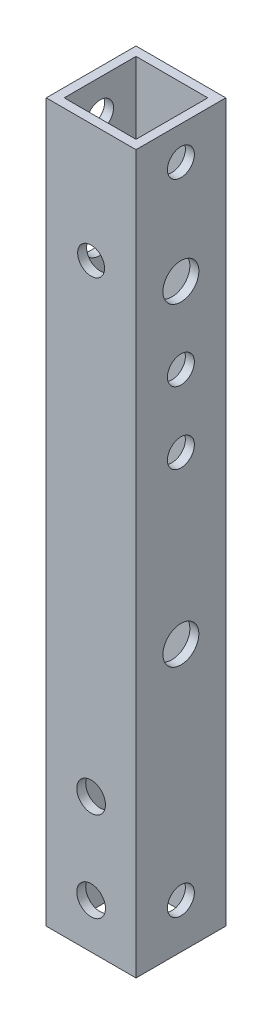
ISO-10303-21;
HEADER;
FILE_DESCRIPTION(('STEP AP214'),'2;1');
FILE_NAME('part.step','',(''),(''),'','','');
FILE_SCHEMA(('AUTOMOTIVE_DESIGN { 1 0 10303 214 1 1 1 1 }'));
ENDSEC;
DATA;
#1=APPLICATION_CONTEXT('core data for automotive mechanical design processes');
#2=APPLICATION_PROTOCOL_DEFINITION('international standard','automotive_design',2000,#1);
#3=PRODUCT_CONTEXT('',#1,'mechanical');
#4=PRODUCT('Part','Part','',(#3));
#5=PRODUCT_RELATED_PRODUCT_CATEGORY('part','',(#4));
#6=PRODUCT_DEFINITION_FORMATION('','',#4);
#7=PRODUCT_DEFINITION_CONTEXT('part definition',#1,'design');
#8=PRODUCT_DEFINITION('design','',#6,#7);
#9=PRODUCT_DEFINITION_SHAPE('','',#8);
#10=(LENGTH_UNIT() NAMED_UNIT(*) SI_UNIT(.MILLI.,.METRE.));
#11=(NAMED_UNIT(*) PLANE_ANGLE_UNIT() SI_UNIT($,.RADIAN.));
#12=(NAMED_UNIT(*) SI_UNIT($,.STERADIAN.) SOLID_ANGLE_UNIT());
#13=UNCERTAINTY_MEASURE_WITH_UNIT(LENGTH_MEASURE(1.E-05),#10,'distance_accuracy_value','');
#14=(GEOMETRIC_REPRESENTATION_CONTEXT(3) GLOBAL_UNCERTAINTY_ASSIGNED_CONTEXT((#13)) GLOBAL_UNIT_ASSIGNED_CONTEXT((#10,
#11,#12)) REPRESENTATION_CONTEXT('',''));
#15=CARTESIAN_POINT('',(0.,0.,0.));
#16=DIRECTION('',(0.,0.,1.));
#17=DIRECTION('',(1.,0.,0.));
#18=AXIS2_PLACEMENT_3D('',#15,#16,#17);
#19=CARTESIAN_POINT('',(0.,0.,0.));
#20=DIRECTION('',(0.,1.,0.));
#21=DIRECTION('',(0.,0.,1.));
#22=AXIS2_PLACEMENT_3D('',#19,#20,#21);
#23=PLANE('',#22);
#24=DIRECTION('',(0.,0.,-1.));
#25=VECTOR('',#24,1.);
#26=CARTESIAN_POINT('',(5.,0.,5.));
#27=LINE('',#26,#25);
#28=CARTESIAN_POINT('',(5.,0.,5.));
#29=VERTEX_POINT('',#28);
#30=CARTESIAN_POINT('',(5.,0.,-5.));
#31=VERTEX_POINT('',#30);
#32=EDGE_CURVE('E146',#29,#31,#27,.T.);
#33=ORIENTED_EDGE('',*,*,#32,.F.);
#34=DIRECTION('',(1.,0.,0.));
#35=VECTOR('',#34,1.);
#36=CARTESIAN_POINT('',(-5.,0.,5.));
#37=LINE('',#36,#35);
#38=CARTESIAN_POINT('',(-5.,0.,5.));
#39=VERTEX_POINT('',#38);
#40=EDGE_CURVE('E281',#39,#29,#37,.T.);
#41=ORIENTED_EDGE('',*,*,#40,.F.);
#42=DIRECTION('',(0.,0.,1.));
#43=VECTOR('',#42,1.);
#44=CARTESIAN_POINT('',(-5.,0.,5.));
#45=LINE('',#44,#43);
#46=CARTESIAN_POINT('',(-5.,0.,-5.));
#47=VERTEX_POINT('',#46);
#48=EDGE_CURVE('E277',#47,#39,#45,.T.);
#49=ORIENTED_EDGE('',*,*,#48,.F.);
#50=DIRECTION('',(-1.,0.,0.));
#51=VECTOR('',#50,1.);
#52=CARTESIAN_POINT('',(-5.,0.,-5.));
#53=LINE('',#52,#51);
#54=EDGE_CURVE('E274',#31,#47,#53,.T.);
#55=ORIENTED_EDGE('',*,*,#54,.F.);
#56=EDGE_LOOP('',(#33,#41,#49,#55));
#57=FACE_BOUND('',#56,.T.);
#58=DIRECTION('',(0.,0.,-1.));
#59=VECTOR('',#58,1.);
#60=CARTESIAN_POINT('',(4.,0.,0.));
#61=LINE('',#60,#59);
#62=CARTESIAN_POINT('',(4.,0.,4.));
#63=VERTEX_POINT('',#62);
#64=CARTESIAN_POINT('',(4.,0.,-4.));
#65=VERTEX_POINT('',#64);
#66=EDGE_CURVE('E244',#63,#65,#61,.T.);
#67=ORIENTED_EDGE('',*,*,#66,.T.);
#68=DIRECTION('',(-1.,0.,0.));
#69=VECTOR('',#68,1.);
#70=CARTESIAN_POINT('',(0.,0.,-4.));
#71=LINE('',#70,#69);
#72=CARTESIAN_POINT('',(-4.,0.,-4.));
#73=VERTEX_POINT('',#72);
#74=EDGE_CURVE('E248',#65,#73,#71,.T.);
#75=ORIENTED_EDGE('',*,*,#74,.T.);
#76=DIRECTION('',(0.,0.,1.));
#77=VECTOR('',#76,1.);
#78=CARTESIAN_POINT('',(-4.,0.,0.));
#79=LINE('',#78,#77);
#80=CARTESIAN_POINT('',(-4.,0.,4.));
#81=VERTEX_POINT('',#80);
#82=EDGE_CURVE('E252',#73,#81,#79,.T.);
#83=ORIENTED_EDGE('',*,*,#82,.T.);
#84=DIRECTION('',(1.,0.,0.));
#85=VECTOR('',#84,1.);
#86=CARTESIAN_POINT('',(0.,0.,4.));
#87=LINE('',#86,#85);
#88=EDGE_CURVE('E256',#81,#63,#87,.T.);
#89=ORIENTED_EDGE('',*,*,#88,.T.);
#90=EDGE_LOOP('',(#67,#75,#83,#89));
#91=FACE_BOUND('',#90,.T.);
#92=ADVANCED_FACE('F63',(#57,#91),#23,.F.);
#93=CARTESIAN_POINT('',(5.,104.9,5.));
#94=DIRECTION('',(-1.,0.,0.));
#95=DIRECTION('',(0.,0.,1.));
#96=AXIS2_PLACEMENT_3D('',#93,#94,#95);
#97=PLANE('',#96);
#98=CARTESIAN_POINT('',(5.,5.,0.));
#99=DIRECTION('',(1.,0.,0.));
#100=DIRECTION('',(0.,0.,-1.));
#101=AXIS2_PLACEMENT_3D('',#98,#99,#100);
#102=CIRCLE('',#101,1.5);
#103=CARTESIAN_POINT('',(5.,5.,-1.5));
#104=VERTEX_POINT('',#103);
#105=EDGE_CURVE('E333',#104,#104,#102,.T.);
#106=ORIENTED_EDGE('',*,*,#105,.F.);
#107=EDGE_LOOP('',(#106));
#108=FACE_BOUND('',#107,.T.);
#109=CARTESIAN_POINT('',(5.,29.7,0.));
#110=DIRECTION('',(1.,0.,0.));
#111=DIRECTION('',(0.,0.,-1.));
#112=AXIS2_PLACEMENT_3D('',#109,#110,#111);
#113=CIRCLE('',#112,2.);
#114=CARTESIAN_POINT('',(5.,29.7,-2.));
#115=VERTEX_POINT('',#114);
#116=EDGE_CURVE('E357',#115,#115,#113,.T.);
#117=ORIENTED_EDGE('',*,*,#116,.F.);
#118=EDGE_LOOP('',(#117));
#119=FACE_BOUND('',#118,.T.);
#120=CARTESIAN_POINT('',(5.,76.2,0.));
#121=DIRECTION('',(1.,0.,0.));
#122=DIRECTION('',(0.,0.,-1.));
#123=AXIS2_PLACEMENT_3D('',#120,#121,#122);
#124=CIRCLE('',#123,1.5);
#125=CARTESIAN_POINT('',(5.,76.2,-1.5));
#126=VERTEX_POINT('',#125);
#127=EDGE_CURVE('E338',#126,#126,#124,.T.);
#128=ORIENTED_EDGE('',*,*,#127,.F.);
#129=EDGE_LOOP('',(#128));
#130=FACE_BOUND('',#129,.T.);
#131=CARTESIAN_POINT('',(5.,48.2,0.));
#132=DIRECTION('',(1.,0.,0.));
#133=DIRECTION('',(0.,0.,-1.));
#134=AXIS2_PLACEMENT_3D('',#131,#132,#133);
#135=CIRCLE('',#134,1.5);
#136=CARTESIAN_POINT('',(5.,48.2,-1.5));
#137=VERTEX_POINT('',#136);
#138=EDGE_CURVE('E339',#137,#137,#135,.T.);
#139=ORIENTED_EDGE('',*,*,#138,.F.);
#140=EDGE_LOOP('',(#139));
#141=FACE_BOUND('',#140,.T.);
#142=CARTESIAN_POINT('',(5.,56.2,0.));
#143=DIRECTION('',(1.,0.,0.));
#144=DIRECTION('',(0.,0.,-1.));
#145=AXIS2_PLACEMENT_3D('',#142,#143,#144);
#146=CIRCLE('',#145,1.5);
#147=CARTESIAN_POINT('',(5.,56.2,-1.5));
#148=VERTEX_POINT('',#147);
#149=EDGE_CURVE('E347',#148,#148,#146,.T.);
#150=ORIENTED_EDGE('',*,*,#149,.F.);
#151=EDGE_LOOP('',(#150));
#152=FACE_BOUND('',#151,.T.);
#153=CARTESIAN_POINT('',(5.,64.7,0.));
#154=DIRECTION('',(1.,0.,0.));
#155=DIRECTION('',(0.,0.,-1.));
#156=AXIS2_PLACEMENT_3D('',#153,#154,#155);
#157=CIRCLE('',#156,2.);
#158=CARTESIAN_POINT('',(5.,64.7,-2.));
#159=VERTEX_POINT('',#158);
#160=EDGE_CURVE('E356',#159,#159,#157,.T.);
#161=ORIENTED_EDGE('',*,*,#160,.F.);
#162=EDGE_LOOP('',(#161));
#163=FACE_BOUND('',#162,.T.);
#164=DIRECTION('',(0.,-1.,0.));
#165=VECTOR('',#164,1.);
#166=CARTESIAN_POINT('',(5.,104.9,-5.));
#167=LINE('',#166,#165);
#168=CARTESIAN_POINT('',(5.,79.9,-5.));
#169=VERTEX_POINT('',#168);
#170=EDGE_CURVE('E72',#169,#31,#167,.T.);
#171=ORIENTED_EDGE('',*,*,#170,.F.);
#172=DIRECTION('',(0.,0.,-1.));
#173=VECTOR('',#172,1.);
#174=CARTESIAN_POINT('',(5.,79.9,5.));
#175=LINE('',#174,#173);
#176=CARTESIAN_POINT('',(5.,79.9,5.));
#177=VERTEX_POINT('',#176);
#178=EDGE_CURVE('E126',#177,#169,#175,.T.);
#179=ORIENTED_EDGE('',*,*,#178,.F.);
#180=DIRECTION('',(0.,-1.,0.));
#181=VECTOR('',#180,1.);
#182=CARTESIAN_POINT('',(5.,104.9,5.));
#183=LINE('',#182,#181);
#184=EDGE_CURVE('E285',#177,#29,#183,.T.);
#185=ORIENTED_EDGE('',*,*,#184,.T.);
#186=ORIENTED_EDGE('',*,*,#32,.T.);
#187=EDGE_LOOP('',(#171,#179,#185,#186));
#188=FACE_BOUND('',#187,.T.);
#189=ADVANCED_FACE('F65',(#108,#119,#130,#141,#152,#163,#188),#97,.F.);
#190=CARTESIAN_POINT('',(-5.,104.9,-5.));
#191=DIRECTION('',(0.,0.,1.));
#192=DIRECTION('',(1.,0.,0.));
#193=AXIS2_PLACEMENT_3D('',#190,#191,#192);
#194=PLANE('',#193);
#195=CARTESIAN_POINT('',(0.,5.,-5.));
#196=DIRECTION('',(0.,0.,1.));
#197=DIRECTION('',(1.,0.,0.));
#198=AXIS2_PLACEMENT_3D('',#195,#196,#197);
#199=CIRCLE('',#198,1.6);
#200=CARTESIAN_POINT('',(1.6,5.,-5.));
#201=VERTEX_POINT('',#200);
#202=EDGE_CURVE('E159',#201,#201,#199,.T.);
#203=ORIENTED_EDGE('',*,*,#202,.T.);
#204=EDGE_LOOP('',(#203));
#205=FACE_BOUND('',#204,.T.);
#206=CARTESIAN_POINT('',(0.,66.7,-5.));
#207=DIRECTION('',(0.,0.,1.));
#208=DIRECTION('',(1.,0.,0.));
#209=AXIS2_PLACEMENT_3D('',#206,#207,#208);
#210=CIRCLE('',#209,1.5);
#211=CARTESIAN_POINT('',(1.5,66.7,-5.));
#212=VERTEX_POINT('',#211);
#213=EDGE_CURVE('E228',#212,#212,#210,.T.);
#214=ORIENTED_EDGE('',*,*,#213,.T.);
#215=EDGE_LOOP('',(#214));
#216=FACE_BOUND('',#215,.T.);
#217=CARTESIAN_POINT('',(0.,15.,-5.));
#218=DIRECTION('',(0.,0.,1.));
#219=DIRECTION('',(1.,0.,0.));
#220=AXIS2_PLACEMENT_3D('',#217,#218,#219);
#221=CIRCLE('',#220,1.6);
#222=CARTESIAN_POINT('',(1.6,15.,-5.));
#223=VERTEX_POINT('',#222);
#224=EDGE_CURVE('E213',#223,#223,#221,.T.);
#225=ORIENTED_EDGE('',*,*,#224,.T.);
#226=EDGE_LOOP('',(#225));
#227=FACE_BOUND('',#226,.T.);
#228=DIRECTION('',(0.,-1.,0.));
#229=VECTOR('',#228,1.);
#230=CARTESIAN_POINT('',(-5.,104.9,-5.));
#231=LINE('',#230,#229);
#232=CARTESIAN_POINT('',(-5.,79.9,-5.));
#233=VERTEX_POINT('',#232);
#234=EDGE_CURVE('E141',#233,#47,#231,.T.);
#235=ORIENTED_EDGE('',*,*,#234,.F.);
#236=DIRECTION('',(-1.,0.,0.));
#237=VECTOR('',#236,1.);
#238=CARTESIAN_POINT('',(-5.,79.9,-5.));
#239=LINE('',#238,#237);
#240=EDGE_CURVE('E129',#169,#233,#239,.T.);
#241=ORIENTED_EDGE('',*,*,#240,.F.);
#242=ORIENTED_EDGE('',*,*,#170,.T.);
#243=ORIENTED_EDGE('',*,*,#54,.T.);
#244=EDGE_LOOP('',(#235,#241,#242,#243));
#245=FACE_BOUND('',#244,.T.);
#246=ADVANCED_FACE('F138',(#205,#216,#227,#245),#194,.F.);
#247=CARTESIAN_POINT('',(-5.,104.9,5.));
#248=DIRECTION('',(1.,0.,0.));
#249=DIRECTION('',(0.,0.,-1.));
#250=AXIS2_PLACEMENT_3D('',#247,#248,#249);
#251=PLANE('',#250);
#252=CARTESIAN_POINT('',(-5.,5.,0.));
#253=DIRECTION('',(1.,0.,0.));
#254=DIRECTION('',(0.,0.,-1.));
#255=AXIS2_PLACEMENT_3D('',#252,#253,#254);
#256=CIRCLE('',#255,1.5);
#257=CARTESIAN_POINT('',(-5.,5.,-1.5));
#258=VERTEX_POINT('',#257);
#259=EDGE_CURVE('E351',#258,#258,#256,.T.);
#260=ORIENTED_EDGE('',*,*,#259,.T.);
#261=EDGE_LOOP('',(#260));
#262=FACE_BOUND('',#261,.T.);
#263=CARTESIAN_POINT('',(-5.,29.7,0.));
#264=DIRECTION('',(1.,0.,0.));
#265=DIRECTION('',(0.,0.,-1.));
#266=AXIS2_PLACEMENT_3D('',#263,#264,#265);
#267=CIRCLE('',#266,2.);
#268=CARTESIAN_POINT('',(-5.,29.7,-2.));
#269=VERTEX_POINT('',#268);
#270=EDGE_CURVE('E352',#269,#269,#267,.T.);
#271=ORIENTED_EDGE('',*,*,#270,.T.);
#272=EDGE_LOOP('',(#271));
#273=FACE_BOUND('',#272,.T.);
#274=CARTESIAN_POINT('',(-5.,76.2,0.));
#275=DIRECTION('',(1.,0.,0.));
#276=DIRECTION('',(0.,0.,-1.));
#277=AXIS2_PLACEMENT_3D('',#274,#275,#276);
#278=CIRCLE('',#277,1.5);
#279=CARTESIAN_POINT('',(-5.,76.2,-1.5));
#280=VERTEX_POINT('',#279);
#281=EDGE_CURVE('E361',#280,#280,#278,.T.);
#282=ORIENTED_EDGE('',*,*,#281,.T.);
#283=EDGE_LOOP('',(#282));
#284=FACE_BOUND('',#283,.T.);
#285=CARTESIAN_POINT('',(-5.,48.2,0.));
#286=DIRECTION('',(1.,0.,0.));
#287=DIRECTION('',(0.,0.,-1.));
#288=AXIS2_PLACEMENT_3D('',#285,#286,#287);
#289=CIRCLE('',#288,1.5);
#290=CARTESIAN_POINT('',(-5.,48.2,-1.5));
#291=VERTEX_POINT('',#290);
#292=EDGE_CURVE('E334',#291,#291,#289,.T.);
#293=ORIENTED_EDGE('',*,*,#292,.T.);
#294=EDGE_LOOP('',(#293));
#295=FACE_BOUND('',#294,.T.);
#296=CARTESIAN_POINT('',(-5.,56.2,0.));
#297=DIRECTION('',(1.,0.,0.));
#298=DIRECTION('',(0.,0.,-1.));
#299=AXIS2_PLACEMENT_3D('',#296,#297,#298);
#300=CIRCLE('',#299,1.5);
#301=CARTESIAN_POINT('',(-5.,56.2,-1.5));
#302=VERTEX_POINT('',#301);
#303=EDGE_CURVE('E343',#302,#302,#300,.T.);
#304=ORIENTED_EDGE('',*,*,#303,.T.);
#305=EDGE_LOOP('',(#304));
#306=FACE_BOUND('',#305,.T.);
#307=CARTESIAN_POINT('',(-5.,64.7,0.));
#308=DIRECTION('',(1.,0.,0.));
#309=DIRECTION('',(0.,0.,-1.));
#310=AXIS2_PLACEMENT_3D('',#307,#308,#309);
#311=CIRCLE('',#310,2.);
#312=CARTESIAN_POINT('',(-5.,64.7,-2.));
#313=VERTEX_POINT('',#312);
#314=EDGE_CURVE('E175',#313,#313,#311,.T.);
#315=ORIENTED_EDGE('',*,*,#314,.T.);
#316=EDGE_LOOP('',(#315));
#317=FACE_BOUND('',#316,.T.);
#318=DIRECTION('',(0.,-1.,0.));
#319=VECTOR('',#318,1.);
#320=CARTESIAN_POINT('',(-5.,104.9,5.));
#321=LINE('',#320,#319);
#322=CARTESIAN_POINT('',(-5.,79.9,5.));
#323=VERTEX_POINT('',#322);
#324=EDGE_CURVE('E150',#323,#39,#321,.T.);
#325=ORIENTED_EDGE('',*,*,#324,.F.);
#326=DIRECTION('',(0.,0.,1.));
#327=VECTOR('',#326,1.);
#328=CARTESIAN_POINT('',(-5.,79.9,5.));
#329=LINE('',#328,#327);
#330=EDGE_CURVE('E79',#233,#323,#329,.T.);
#331=ORIENTED_EDGE('',*,*,#330,.F.);
#332=ORIENTED_EDGE('',*,*,#234,.T.);
#333=ORIENTED_EDGE('',*,*,#48,.T.);
#334=EDGE_LOOP('',(#325,#331,#332,#333));
#335=FACE_BOUND('',#334,.T.);
#336=ADVANCED_FACE('F294',(#262,#273,#284,#295,#306,#317,#335),#251,.F.);
#337=CARTESIAN_POINT('',(-5.,104.9,5.));
#338=DIRECTION('',(0.,0.,-1.));
#339=DIRECTION('',(-1.,0.,0.));
#340=AXIS2_PLACEMENT_3D('',#337,#338,#339);
#341=PLANE('',#340);
#342=CARTESIAN_POINT('',(0.,5.,5.));
#343=DIRECTION('',(0.,0.,1.));
#344=DIRECTION('',(1.,0.,0.));
#345=AXIS2_PLACEMENT_3D('',#342,#343,#344);
#346=CIRCLE('',#345,1.6);
#347=CARTESIAN_POINT('',(1.6,5.,5.));
#348=VERTEX_POINT('',#347);
#349=EDGE_CURVE('E224',#348,#348,#346,.T.);
#350=ORIENTED_EDGE('',*,*,#349,.F.);
#351=EDGE_LOOP('',(#350));
#352=FACE_BOUND('',#351,.T.);
#353=CARTESIAN_POINT('',(0.,66.7,5.));
#354=DIRECTION('',(0.,0.,1.));
#355=DIRECTION('',(1.,0.,0.));
#356=AXIS2_PLACEMENT_3D('',#353,#354,#355);
#357=CIRCLE('',#356,1.5);
#358=CARTESIAN_POINT('',(1.5,66.7,5.));
#359=VERTEX_POINT('',#358);
#360=EDGE_CURVE('E217',#359,#359,#357,.T.);
#361=ORIENTED_EDGE('',*,*,#360,.F.);
#362=EDGE_LOOP('',(#361));
#363=FACE_BOUND('',#362,.T.);
#364=CARTESIAN_POINT('',(0.,15.,5.));
#365=DIRECTION('',(0.,0.,1.));
#366=DIRECTION('',(1.,0.,0.));
#367=AXIS2_PLACEMENT_3D('',#364,#365,#366);
#368=CIRCLE('',#367,1.6);
#369=CARTESIAN_POINT('',(1.6,15.,5.));
#370=VERTEX_POINT('',#369);
#371=EDGE_CURVE('E204',#370,#370,#368,.T.);
#372=ORIENTED_EDGE('',*,*,#371,.F.);
#373=EDGE_LOOP('',(#372));
#374=FACE_BOUND('',#373,.T.);
#375=ORIENTED_EDGE('',*,*,#184,.F.);
#376=DIRECTION('',(1.,0.,0.));
#377=VECTOR('',#376,1.);
#378=CARTESIAN_POINT('',(-5.,79.9,5.));
#379=LINE('',#378,#377);
#380=EDGE_CURVE('E130',#323,#177,#379,.T.);
#381=ORIENTED_EDGE('',*,*,#380,.F.);
#382=ORIENTED_EDGE('',*,*,#324,.T.);
#383=ORIENTED_EDGE('',*,*,#40,.T.);
#384=EDGE_LOOP('',(#375,#381,#382,#383));
#385=FACE_BOUND('',#384,.T.);
#386=ADVANCED_FACE('F290',(#352,#363,#374,#385),#341,.F.);
#387=CARTESIAN_POINT('',(4.,104.9,0.));
#388=DIRECTION('',(-1.,0.,0.));
#389=DIRECTION('',(0.,0.,1.));
#390=AXIS2_PLACEMENT_3D('',#387,#388,#389);
#391=PLANE('',#390);
#392=DIRECTION('',(0.,0.,1.));
#393=VECTOR('',#392,1.);
#394=CARTESIAN_POINT('',(4.,79.9,0.));
#395=LINE('',#394,#393);
#396=CARTESIAN_POINT('',(4.,79.9,-4.));
#397=VERTEX_POINT('',#396);
#398=CARTESIAN_POINT('',(4.,79.9,4.));
#399=VERTEX_POINT('',#398);
#400=EDGE_CURVE('E86',#397,#399,#395,.T.);
#401=ORIENTED_EDGE('',*,*,#400,.F.);
#402=DIRECTION('',(0.,-1.,0.));
#403=VECTOR('',#402,1.);
#404=CARTESIAN_POINT('',(4.,104.9,-4.));
#405=LINE('',#404,#403);
#406=EDGE_CURVE('E269',#397,#65,#405,.T.);
#407=ORIENTED_EDGE('',*,*,#406,.T.);
#408=ORIENTED_EDGE('',*,*,#66,.F.);
#409=DIRECTION('',(0.,-1.,0.));
#410=VECTOR('',#409,1.);
#411=CARTESIAN_POINT('',(4.,104.9,4.));
#412=LINE('',#411,#410);
#413=EDGE_CURVE('E260',#399,#63,#412,.T.);
#414=ORIENTED_EDGE('',*,*,#413,.F.);
#415=EDGE_LOOP('',(#401,#407,#408,#414));
#416=FACE_BOUND('',#415,.T.);
#417=CARTESIAN_POINT('',(4.,5.,0.));
#418=DIRECTION('',(-1.,0.,0.));
#419=DIRECTION('',(0.,0.,1.));
#420=AXIS2_PLACEMENT_3D('',#417,#418,#419);
#421=CIRCLE('',#420,1.5);
#422=CARTESIAN_POINT('',(4.,5.,1.5));
#423=VERTEX_POINT('',#422);
#424=EDGE_CURVE('E198',#423,#423,#421,.T.);
#425=ORIENTED_EDGE('',*,*,#424,.F.);
#426=EDGE_LOOP('',(#425));
#427=FACE_BOUND('',#426,.T.);
#428=CARTESIAN_POINT('',(4.,29.7,0.));
#429=DIRECTION('',(-1.,0.,0.));
#430=DIRECTION('',(0.,0.,1.));
#431=AXIS2_PLACEMENT_3D('',#428,#429,#430);
#432=CIRCLE('',#431,2.);
#433=CARTESIAN_POINT('',(4.,29.7,2.));
#434=VERTEX_POINT('',#433);
#435=EDGE_CURVE('E194',#434,#434,#432,.T.);
#436=ORIENTED_EDGE('',*,*,#435,.F.);
#437=EDGE_LOOP('',(#436));
#438=FACE_BOUND('',#437,.T.);
#439=CARTESIAN_POINT('',(4.,76.2,0.));
#440=DIRECTION('',(-1.,0.,0.));
#441=DIRECTION('',(0.,0.,1.));
#442=AXIS2_PLACEMENT_3D('',#439,#440,#441);
#443=CIRCLE('',#442,1.5);
#444=CARTESIAN_POINT('',(4.,76.2,1.5));
#445=VERTEX_POINT('',#444);
#446=EDGE_CURVE('E190',#445,#445,#443,.T.);
#447=ORIENTED_EDGE('',*,*,#446,.F.);
#448=EDGE_LOOP('',(#447));
#449=FACE_BOUND('',#448,.T.);
#450=CARTESIAN_POINT('',(4.,48.2,0.));
#451=DIRECTION('',(-1.,0.,0.));
#452=DIRECTION('',(0.,0.,1.));
#453=AXIS2_PLACEMENT_3D('',#450,#451,#452);
#454=CIRCLE('',#453,1.5);
#455=CARTESIAN_POINT('',(4.,48.2,1.5));
#456=VERTEX_POINT('',#455);
#457=EDGE_CURVE('E185',#456,#456,#454,.T.);
#458=ORIENTED_EDGE('',*,*,#457,.F.);
#459=EDGE_LOOP('',(#458));
#460=FACE_BOUND('',#459,.T.);
#461=CARTESIAN_POINT('',(4.,56.2,0.));
#462=DIRECTION('',(-1.,0.,0.));
#463=DIRECTION('',(0.,0.,1.));
#464=AXIS2_PLACEMENT_3D('',#461,#462,#463);
#465=CIRCLE('',#464,1.5);
#466=CARTESIAN_POINT('',(4.,56.2,1.5));
#467=VERTEX_POINT('',#466);
#468=EDGE_CURVE('E180',#467,#467,#465,.T.);
#469=ORIENTED_EDGE('',*,*,#468,.F.);
#470=EDGE_LOOP('',(#469));
#471=FACE_BOUND('',#470,.T.);
#472=CARTESIAN_POINT('',(4.,64.7,0.));
#473=DIRECTION('',(-1.,0.,0.));
#474=DIRECTION('',(0.,0.,1.));
#475=AXIS2_PLACEMENT_3D('',#472,#473,#474);
#476=CIRCLE('',#475,2.);
#477=CARTESIAN_POINT('',(4.,64.7,2.));
#478=VERTEX_POINT('',#477);
#479=EDGE_CURVE('E174',#478,#478,#476,.T.);
#480=ORIENTED_EDGE('',*,*,#479,.F.);
#481=EDGE_LOOP('',(#480));
#482=FACE_BOUND('',#481,.T.);
#483=ADVANCED_FACE('F304',(#416,#427,#438,#449,#460,#471,#482),#391,.T.);
#484=CARTESIAN_POINT('',(0.,104.9,-4.));
#485=DIRECTION('',(0.,0.,1.));
#486=DIRECTION('',(1.,0.,0.));
#487=AXIS2_PLACEMENT_3D('',#484,#485,#486);
#488=PLANE('',#487);
#489=DIRECTION('',(1.,0.,0.));
#490=VECTOR('',#489,1.);
#491=CARTESIAN_POINT('',(0.,79.9,-4.));
#492=LINE('',#491,#490);
#493=CARTESIAN_POINT('',(-4.,79.9,-4.));
#494=VERTEX_POINT('',#493);
#495=EDGE_CURVE('E313',#494,#397,#492,.T.);
#496=ORIENTED_EDGE('',*,*,#495,.F.);
#497=DIRECTION('',(0.,-1.,0.));
#498=VECTOR('',#497,1.);
#499=CARTESIAN_POINT('',(-4.,104.9,-4.));
#500=LINE('',#499,#498);
#501=EDGE_CURVE('E266',#494,#73,#500,.T.);
#502=ORIENTED_EDGE('',*,*,#501,.T.);
#503=ORIENTED_EDGE('',*,*,#74,.F.);
#504=ORIENTED_EDGE('',*,*,#406,.F.);
#505=EDGE_LOOP('',(#496,#502,#503,#504));
#506=FACE_BOUND('',#505,.T.);
#507=CARTESIAN_POINT('',(0.,5.,-4.));
#508=DIRECTION('',(0.,0.,1.));
#509=DIRECTION('',(1.,0.,0.));
#510=AXIS2_PLACEMENT_3D('',#507,#508,#509);
#511=CIRCLE('',#510,1.6);
#512=CARTESIAN_POINT('',(1.6,5.,-4.));
#513=VERTEX_POINT('',#512);
#514=EDGE_CURVE('E169',#513,#513,#511,.T.);
#515=ORIENTED_EDGE('',*,*,#514,.F.);
#516=EDGE_LOOP('',(#515));
#517=FACE_BOUND('',#516,.T.);
#518=CARTESIAN_POINT('',(0.,66.7,-4.));
#519=DIRECTION('',(0.,0.,1.));
#520=DIRECTION('',(1.,0.,0.));
#521=AXIS2_PLACEMENT_3D('',#518,#519,#520);
#522=CIRCLE('',#521,1.5);
#523=CARTESIAN_POINT('',(1.5,66.7,-4.));
#524=VERTEX_POINT('',#523);
#525=EDGE_CURVE('E164',#524,#524,#522,.T.);
#526=ORIENTED_EDGE('',*,*,#525,.F.);
#527=EDGE_LOOP('',(#526));
#528=FACE_BOUND('',#527,.T.);
#529=CARTESIAN_POINT('',(0.,15.,-4.));
#530=DIRECTION('',(0.,0.,1.));
#531=DIRECTION('',(1.,0.,0.));
#532=AXIS2_PLACEMENT_3D('',#529,#530,#531);
#533=CIRCLE('',#532,1.6);
#534=CARTESIAN_POINT('',(1.6,15.,-4.));
#535=VERTEX_POINT('',#534);
#536=EDGE_CURVE('E158',#535,#535,#533,.T.);
#537=ORIENTED_EDGE('',*,*,#536,.F.);
#538=EDGE_LOOP('',(#537));
#539=FACE_BOUND('',#538,.T.);
#540=ADVANCED_FACE('F309',(#506,#517,#528,#539),#488,.T.);
#541=CARTESIAN_POINT('',(-4.,104.9,0.));
#542=DIRECTION('',(1.,0.,0.));
#543=DIRECTION('',(0.,0.,-1.));
#544=AXIS2_PLACEMENT_3D('',#541,#542,#543);
#545=PLANE('',#544);
#546=DIRECTION('',(0.,0.,-1.));
#547=VECTOR('',#546,1.);
#548=CARTESIAN_POINT('',(-4.,79.9,0.));
#549=LINE('',#548,#547);
#550=CARTESIAN_POINT('',(-4.,79.9,4.));
#551=VERTEX_POINT('',#550);
#552=EDGE_CURVE('E319',#551,#494,#549,.T.);
#553=ORIENTED_EDGE('',*,*,#552,.F.);
#554=DIRECTION('',(0.,-1.,0.));
#555=VECTOR('',#554,1.);
#556=CARTESIAN_POINT('',(-4.,104.9,4.));
#557=LINE('',#556,#555);
#558=EDGE_CURVE('E263',#551,#81,#557,.T.);
#559=ORIENTED_EDGE('',*,*,#558,.T.);
#560=ORIENTED_EDGE('',*,*,#82,.F.);
#561=ORIENTED_EDGE('',*,*,#501,.F.);
#562=EDGE_LOOP('',(#553,#559,#560,#561));
#563=FACE_BOUND('',#562,.T.);
#564=CARTESIAN_POINT('',(-4.,5.,0.));
#565=DIRECTION('',(1.,0.,0.));
#566=DIRECTION('',(0.,0.,-1.));
#567=AXIS2_PLACEMENT_3D('',#564,#565,#566);
#568=CIRCLE('',#567,1.5);
#569=CARTESIAN_POINT('',(-4.,5.,-1.5));
#570=VERTEX_POINT('',#569);
#571=EDGE_CURVE('E195',#570,#570,#568,.T.);
#572=ORIENTED_EDGE('',*,*,#571,.F.);
#573=EDGE_LOOP('',(#572));
#574=FACE_BOUND('',#573,.T.);
#575=CARTESIAN_POINT('',(-4.,29.7,0.));
#576=DIRECTION('',(1.,0.,0.));
#577=DIRECTION('',(0.,0.,-1.));
#578=AXIS2_PLACEMENT_3D('',#575,#576,#577);
#579=CIRCLE('',#578,2.);
#580=CARTESIAN_POINT('',(-4.,29.7,-2.));
#581=VERTEX_POINT('',#580);
#582=EDGE_CURVE('E191',#581,#581,#579,.T.);
#583=ORIENTED_EDGE('',*,*,#582,.F.);
#584=EDGE_LOOP('',(#583));
#585=FACE_BOUND('',#584,.T.);
#586=CARTESIAN_POINT('',(-4.,76.2,0.));
#587=DIRECTION('',(1.,0.,0.));
#588=DIRECTION('',(0.,0.,-1.));
#589=AXIS2_PLACEMENT_3D('',#586,#587,#588);
#590=CIRCLE('',#589,1.5);
#591=CARTESIAN_POINT('',(-4.,76.2,-1.5));
#592=VERTEX_POINT('',#591);
#593=EDGE_CURVE('E186',#592,#592,#590,.T.);
#594=ORIENTED_EDGE('',*,*,#593,.F.);
#595=EDGE_LOOP('',(#594));
#596=FACE_BOUND('',#595,.T.);
#597=CARTESIAN_POINT('',(-4.,48.2,0.));
#598=DIRECTION('',(1.,0.,0.));
#599=DIRECTION('',(0.,0.,-1.));
#600=AXIS2_PLACEMENT_3D('',#597,#598,#599);
#601=CIRCLE('',#600,1.5);
#602=CARTESIAN_POINT('',(-4.,48.2,-1.5));
#603=VERTEX_POINT('',#602);
#604=EDGE_CURVE('E181',#603,#603,#601,.T.);
#605=ORIENTED_EDGE('',*,*,#604,.F.);
#606=EDGE_LOOP('',(#605));
#607=FACE_BOUND('',#606,.T.);
#608=CARTESIAN_POINT('',(-4.,56.2,0.));
#609=DIRECTION('',(1.,0.,0.));
#610=DIRECTION('',(0.,0.,-1.));
#611=AXIS2_PLACEMENT_3D('',#608,#609,#610);
#612=CIRCLE('',#611,1.5);
#613=CARTESIAN_POINT('',(-4.,56.2,-1.5));
#614=VERTEX_POINT('',#613);
#615=EDGE_CURVE('E176',#614,#614,#612,.T.);
#616=ORIENTED_EDGE('',*,*,#615,.F.);
#617=EDGE_LOOP('',(#616));
#618=FACE_BOUND('',#617,.T.);
#619=CARTESIAN_POINT('',(-4.,64.7,0.));
#620=DIRECTION('',(1.,0.,0.));
#621=DIRECTION('',(0.,0.,-1.));
#622=AXIS2_PLACEMENT_3D('',#619,#620,#621);
#623=CIRCLE('',#622,2.);
#624=CARTESIAN_POINT('',(-4.,64.7,-2.));
#625=VERTEX_POINT('',#624);
#626=EDGE_CURVE('E170',#625,#625,#623,.T.);
#627=ORIENTED_EDGE('',*,*,#626,.F.);
#628=EDGE_LOOP('',(#627));
#629=FACE_BOUND('',#628,.T.);
#630=ADVANCED_FACE('F316',(#563,#574,#585,#596,#607,#618,#629),#545,.T.);
#631=CARTESIAN_POINT('',(0.,104.9,4.));
#632=DIRECTION('',(0.,0.,-1.));
#633=DIRECTION('',(-1.,0.,0.));
#634=AXIS2_PLACEMENT_3D('',#631,#632,#633);
#635=PLANE('',#634);
#636=DIRECTION('',(-1.,0.,0.));
#637=VECTOR('',#636,1.);
#638=CARTESIAN_POINT('',(0.,79.9,4.));
#639=LINE('',#638,#637);
#640=EDGE_CURVE('E12',#399,#551,#639,.T.);
#641=ORIENTED_EDGE('',*,*,#640,.F.);
#642=ORIENTED_EDGE('',*,*,#413,.T.);
#643=ORIENTED_EDGE('',*,*,#88,.F.);
#644=ORIENTED_EDGE('',*,*,#558,.F.);
#645=EDGE_LOOP('',(#641,#642,#643,#644));
#646=FACE_BOUND('',#645,.T.);
#647=CARTESIAN_POINT('',(0.,5.,4.));
#648=DIRECTION('',(0.,0.,-1.));
#649=DIRECTION('',(-1.,0.,0.));
#650=AXIS2_PLACEMENT_3D('',#647,#648,#649);
#651=CIRCLE('',#650,1.6);
#652=CARTESIAN_POINT('',(-1.6,5.,4.));
#653=VERTEX_POINT('',#652);
#654=EDGE_CURVE('E165',#653,#653,#651,.T.);
#655=ORIENTED_EDGE('',*,*,#654,.F.);
#656=EDGE_LOOP('',(#655));
#657=FACE_BOUND('',#656,.T.);
#658=CARTESIAN_POINT('',(0.,66.7,4.));
#659=DIRECTION('',(0.,0.,-1.));
#660=DIRECTION('',(-1.,0.,0.));
#661=AXIS2_PLACEMENT_3D('',#658,#659,#660);
#662=CIRCLE('',#661,1.5);
#663=CARTESIAN_POINT('',(-1.5,66.7,4.));
#664=VERTEX_POINT('',#663);
#665=EDGE_CURVE('E160',#664,#664,#662,.T.);
#666=ORIENTED_EDGE('',*,*,#665,.F.);
#667=EDGE_LOOP('',(#666));
#668=FACE_BOUND('',#667,.T.);
#669=CARTESIAN_POINT('',(0.,15.,4.));
#670=DIRECTION('',(0.,0.,-1.));
#671=DIRECTION('',(-1.,0.,0.));
#672=AXIS2_PLACEMENT_3D('',#669,#670,#671);
#673=CIRCLE('',#672,1.6);
#674=CARTESIAN_POINT('',(-1.6,15.,4.));
#675=VERTEX_POINT('',#674);
#676=EDGE_CURVE('E154',#675,#675,#673,.T.);
#677=ORIENTED_EDGE('',*,*,#676,.F.);
#678=EDGE_LOOP('',(#677));
#679=FACE_BOUND('',#678,.T.);
#680=ADVANCED_FACE('F321',(#646,#657,#668,#679),#635,.T.);
#681=CARTESIAN_POINT('',(0.,15.,-5.));
#682=DIRECTION('',(0.,0.,1.));
#683=DIRECTION('',(1.,0.,0.));
#684=AXIS2_PLACEMENT_3D('',#681,#682,#683);
#685=CYLINDRICAL_SURFACE('',#684,1.6);
#686=ORIENTED_EDGE('',*,*,#676,.T.);
#687=EDGE_LOOP('',(#686));
#688=FACE_BOUND('',#687,.T.);
#689=ORIENTED_EDGE('',*,*,#371,.T.);
#690=EDGE_LOOP('',(#689));
#691=FACE_BOUND('',#690,.T.);
#692=ADVANCED_FACE('F469',(#688,#691),#685,.F.);
#693=CARTESIAN_POINT('',(0.,66.7,-5.));
#694=DIRECTION('',(0.,0.,1.));
#695=DIRECTION('',(1.,0.,0.));
#696=AXIS2_PLACEMENT_3D('',#693,#694,#695);
#697=CYLINDRICAL_SURFACE('',#696,1.5);
#698=ORIENTED_EDGE('',*,*,#665,.T.);
#699=EDGE_LOOP('',(#698));
#700=FACE_BOUND('',#699,.T.);
#701=ORIENTED_EDGE('',*,*,#360,.T.);
#702=EDGE_LOOP('',(#701));
#703=FACE_BOUND('',#702,.T.);
#704=ADVANCED_FACE('F470',(#700,#703),#697,.F.);
#705=CARTESIAN_POINT('',(0.,5.,-5.));
#706=DIRECTION('',(0.,0.,1.));
#707=DIRECTION('',(1.,0.,0.));
#708=AXIS2_PLACEMENT_3D('',#705,#706,#707);
#709=CYLINDRICAL_SURFACE('',#708,1.6);
#710=ORIENTED_EDGE('',*,*,#654,.T.);
#711=EDGE_LOOP('',(#710));
#712=FACE_BOUND('',#711,.T.);
#713=ORIENTED_EDGE('',*,*,#349,.T.);
#714=EDGE_LOOP('',(#713));
#715=FACE_BOUND('',#714,.T.);
#716=ADVANCED_FACE('F473',(#712,#715),#709,.F.);
#717=ORIENTED_EDGE('',*,*,#536,.T.);
#718=EDGE_LOOP('',(#717));
#719=FACE_BOUND('',#718,.T.);
#720=ORIENTED_EDGE('',*,*,#224,.F.);
#721=EDGE_LOOP('',(#720));
#722=FACE_BOUND('',#721,.T.);
#723=ADVANCED_FACE('F478',(#719,#722),#685,.F.);
#724=ORIENTED_EDGE('',*,*,#525,.T.);
#725=EDGE_LOOP('',(#724));
#726=FACE_BOUND('',#725,.T.);
#727=ORIENTED_EDGE('',*,*,#213,.F.);
#728=EDGE_LOOP('',(#727));
#729=FACE_BOUND('',#728,.T.);
#730=ADVANCED_FACE('F475',(#726,#729),#697,.F.);
#731=ORIENTED_EDGE('',*,*,#514,.T.);
#732=EDGE_LOOP('',(#731));
#733=FACE_BOUND('',#732,.T.);
#734=ORIENTED_EDGE('',*,*,#202,.F.);
#735=EDGE_LOOP('',(#734));
#736=FACE_BOUND('',#735,.T.);
#737=ADVANCED_FACE('F444',(#733,#736),#709,.F.);
#738=CARTESIAN_POINT('',(-5.,64.7,0.));
#739=DIRECTION('',(1.,0.,0.));
#740=DIRECTION('',(0.,0.,-1.));
#741=AXIS2_PLACEMENT_3D('',#738,#739,#740);
#742=CYLINDRICAL_SURFACE('',#741,2.);
#743=ORIENTED_EDGE('',*,*,#626,.T.);
#744=EDGE_LOOP('',(#743));
#745=FACE_BOUND('',#744,.T.);
#746=ORIENTED_EDGE('',*,*,#314,.F.);
#747=EDGE_LOOP('',(#746));
#748=FACE_BOUND('',#747,.T.);
#749=ADVANCED_FACE('F405',(#745,#748),#742,.F.);
#750=CARTESIAN_POINT('',(-5.,56.2,0.));
#751=DIRECTION('',(1.,0.,0.));
#752=DIRECTION('',(0.,0.,-1.));
#753=AXIS2_PLACEMENT_3D('',#750,#751,#752);
#754=CYLINDRICAL_SURFACE('',#753,1.5);
#755=ORIENTED_EDGE('',*,*,#615,.T.);
#756=EDGE_LOOP('',(#755));
#757=FACE_BOUND('',#756,.T.);
#758=ORIENTED_EDGE('',*,*,#303,.F.);
#759=EDGE_LOOP('',(#758));
#760=FACE_BOUND('',#759,.T.);
#761=ADVANCED_FACE('F428',(#757,#760),#754,.F.);
#762=CARTESIAN_POINT('',(-5.,48.2,0.));
#763=DIRECTION('',(1.,0.,0.));
#764=DIRECTION('',(0.,0.,-1.));
#765=AXIS2_PLACEMENT_3D('',#762,#763,#764);
#766=CYLINDRICAL_SURFACE('',#765,1.5);
#767=ORIENTED_EDGE('',*,*,#604,.T.);
#768=EDGE_LOOP('',(#767));
#769=FACE_BOUND('',#768,.T.);
#770=ORIENTED_EDGE('',*,*,#292,.F.);
#771=EDGE_LOOP('',(#770));
#772=FACE_BOUND('',#771,.T.);
#773=ADVANCED_FACE('F434',(#769,#772),#766,.F.);
#774=CARTESIAN_POINT('',(-5.,76.2,0.));
#775=DIRECTION('',(1.,0.,0.));
#776=DIRECTION('',(0.,0.,-1.));
#777=AXIS2_PLACEMENT_3D('',#774,#775,#776);
#778=CYLINDRICAL_SURFACE('',#777,1.5);
#779=ORIENTED_EDGE('',*,*,#593,.T.);
#780=EDGE_LOOP('',(#779));
#781=FACE_BOUND('',#780,.T.);
#782=ORIENTED_EDGE('',*,*,#281,.F.);
#783=EDGE_LOOP('',(#782));
#784=FACE_BOUND('',#783,.T.);
#785=ADVANCED_FACE('F442',(#781,#784),#778,.F.);
#786=CARTESIAN_POINT('',(-5.,29.7,0.));
#787=DIRECTION('',(1.,0.,0.));
#788=DIRECTION('',(0.,0.,-1.));
#789=AXIS2_PLACEMENT_3D('',#786,#787,#788);
#790=CYLINDRICAL_SURFACE('',#789,2.);
#791=ORIENTED_EDGE('',*,*,#582,.T.);
#792=EDGE_LOOP('',(#791));
#793=FACE_BOUND('',#792,.T.);
#794=ORIENTED_EDGE('',*,*,#270,.F.);
#795=EDGE_LOOP('',(#794));
#796=FACE_BOUND('',#795,.T.);
#797=ADVANCED_FACE('F485',(#793,#796),#790,.F.);
#798=CARTESIAN_POINT('',(-5.,5.,0.));
#799=DIRECTION('',(1.,0.,0.));
#800=DIRECTION('',(0.,0.,-1.));
#801=AXIS2_PLACEMENT_3D('',#798,#799,#800);
#802=CYLINDRICAL_SURFACE('',#801,1.5);
#803=ORIENTED_EDGE('',*,*,#571,.T.);
#804=EDGE_LOOP('',(#803));
#805=FACE_BOUND('',#804,.T.);
#806=ORIENTED_EDGE('',*,*,#259,.F.);
#807=EDGE_LOOP('',(#806));
#808=FACE_BOUND('',#807,.T.);
#809=ADVANCED_FACE('F403',(#805,#808),#802,.F.);
#810=ORIENTED_EDGE('',*,*,#479,.T.);
#811=EDGE_LOOP('',(#810));
#812=FACE_BOUND('',#811,.T.);
#813=ORIENTED_EDGE('',*,*,#160,.T.);
#814=EDGE_LOOP('',(#813));
#815=FACE_BOUND('',#814,.T.);
#816=ADVANCED_FACE('F399',(#812,#815),#742,.F.);
#817=ORIENTED_EDGE('',*,*,#468,.T.);
#818=EDGE_LOOP('',(#817));
#819=FACE_BOUND('',#818,.T.);
#820=ORIENTED_EDGE('',*,*,#149,.T.);
#821=EDGE_LOOP('',(#820));
#822=FACE_BOUND('',#821,.T.);
#823=ADVANCED_FACE('F402',(#819,#822),#754,.F.);
#824=ORIENTED_EDGE('',*,*,#457,.T.);
#825=EDGE_LOOP('',(#824));
#826=FACE_BOUND('',#825,.T.);
#827=ORIENTED_EDGE('',*,*,#138,.T.);
#828=EDGE_LOOP('',(#827));
#829=FACE_BOUND('',#828,.T.);
#830=ADVANCED_FACE('F389',(#826,#829),#766,.F.);
#831=ORIENTED_EDGE('',*,*,#446,.T.);
#832=EDGE_LOOP('',(#831));
#833=FACE_BOUND('',#832,.T.);
#834=ORIENTED_EDGE('',*,*,#127,.T.);
#835=EDGE_LOOP('',(#834));
#836=FACE_BOUND('',#835,.T.);
#837=ADVANCED_FACE('F432',(#833,#836),#778,.F.);
#838=ORIENTED_EDGE('',*,*,#435,.T.);
#839=EDGE_LOOP('',(#838));
#840=FACE_BOUND('',#839,.T.);
#841=ORIENTED_EDGE('',*,*,#116,.T.);
#842=EDGE_LOOP('',(#841));
#843=FACE_BOUND('',#842,.T.);
#844=ADVANCED_FACE('F491',(#840,#843),#790,.F.);
#845=ORIENTED_EDGE('',*,*,#424,.T.);
#846=EDGE_LOOP('',(#845));
#847=FACE_BOUND('',#846,.T.);
#848=ORIENTED_EDGE('',*,*,#105,.T.);
#849=EDGE_LOOP('',(#848));
#850=FACE_BOUND('',#849,.T.);
#851=ADVANCED_FACE('F486',(#847,#850),#802,.F.);
#852=CARTESIAN_POINT('',(0.,79.9,0.));
#853=DIRECTION('',(0.,-1.,0.));
#854=DIRECTION('',(0.,0.,-1.));
#855=AXIS2_PLACEMENT_3D('',#852,#853,#854);
#856=PLANE('',#855);
#857=ORIENTED_EDGE('',*,*,#400,.T.);
#858=ORIENTED_EDGE('',*,*,#640,.T.);
#859=ORIENTED_EDGE('',*,*,#552,.T.);
#860=ORIENTED_EDGE('',*,*,#495,.T.);
#861=EDGE_LOOP('',(#857,#858,#859,#860));
#862=FACE_BOUND('',#861,.T.);
#863=ORIENTED_EDGE('',*,*,#178,.T.);
#864=ORIENTED_EDGE('',*,*,#240,.T.);
#865=ORIENTED_EDGE('',*,*,#330,.T.);
#866=ORIENTED_EDGE('',*,*,#380,.T.);
#867=EDGE_LOOP('',(#863,#864,#865,#866));
#868=FACE_BOUND('',#867,.T.);
#869=ADVANCED_FACE('F128',(#862,#868),#856,.F.);
#870=CLOSED_SHELL('',(#92,#189,#246,#336,#386,#483,#540,#630,#680,#692,#704,#716,#723,#730,#737,
#749,#761,#773,#785,#797,#809,#816,#823,#830,#837,#844,#851,#869));
#871=MANIFOLD_SOLID_BREP('B2',#870);
#872=ADVANCED_BREP_SHAPE_REPRESENTATION('',(#18,#871),#14);
#873=SHAPE_DEFINITION_REPRESENTATION(#9,#872);
ENDSEC;
END-ISO-10303-21;
